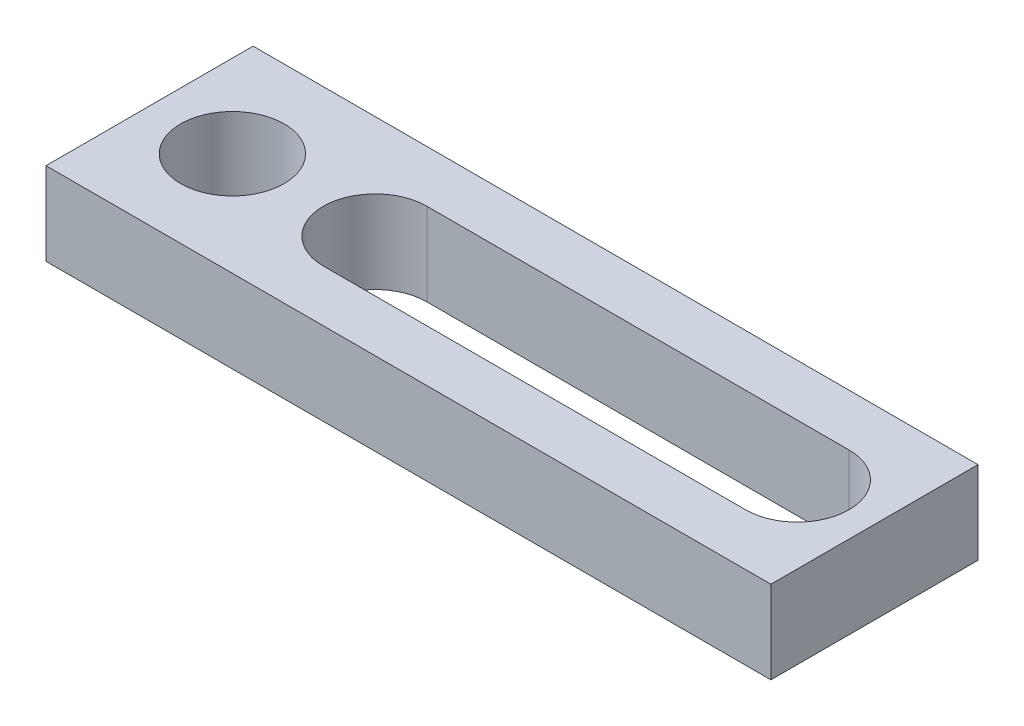
ISO-10303-21;
HEADER;
FILE_DESCRIPTION(('STEP AP214'),'2;1');
FILE_NAME('part.step','',(''),(''),'','','');
FILE_SCHEMA(('AUTOMOTIVE_DESIGN { 1 0 10303 214 1 1 1 1 }'));
ENDSEC;
DATA;
#1=APPLICATION_CONTEXT('core data for automotive mechanical design processes');
#2=APPLICATION_PROTOCOL_DEFINITION('international standard','automotive_design',2000,#1);
#3=PRODUCT_CONTEXT('',#1,'mechanical');
#4=PRODUCT('Part','Part','',(#3));
#5=PRODUCT_RELATED_PRODUCT_CATEGORY('part','',(#4));
#6=PRODUCT_DEFINITION_FORMATION('','',#4);
#7=PRODUCT_DEFINITION_CONTEXT('part definition',#1,'design');
#8=PRODUCT_DEFINITION('design','',#6,#7);
#9=PRODUCT_DEFINITION_SHAPE('','',#8);
#10=(LENGTH_UNIT() NAMED_UNIT(*) SI_UNIT(.MILLI.,.METRE.));
#11=(NAMED_UNIT(*) PLANE_ANGLE_UNIT() SI_UNIT($,.RADIAN.));
#12=(NAMED_UNIT(*) SI_UNIT($,.STERADIAN.) SOLID_ANGLE_UNIT());
#13=UNCERTAINTY_MEASURE_WITH_UNIT(LENGTH_MEASURE(1.E-05),#10,'distance_accuracy_value','');
#14=(GEOMETRIC_REPRESENTATION_CONTEXT(3) GLOBAL_UNCERTAINTY_ASSIGNED_CONTEXT((#13)) GLOBAL_UNIT_ASSIGNED_CONTEXT((#10,
#11,#12)) REPRESENTATION_CONTEXT('',''));
#15=CARTESIAN_POINT('',(0.,0.,0.));
#16=DIRECTION('',(0.,0.,1.));
#17=DIRECTION('',(1.,0.,0.));
#18=AXIS2_PLACEMENT_3D('',#15,#16,#17);
#19=CARTESIAN_POINT('',(0.,8.,0.));
#20=DIRECTION('',(0.,-1.,0.));
#21=DIRECTION('',(0.,0.,-1.));
#22=AXIS2_PLACEMENT_3D('',#19,#20,#21);
#23=PLANE('',#22);
#24=CARTESIAN_POINT('',(-38.,8.,-4.23684583386693));
#25=DIRECTION('',(0.,1.,0.));
#26=DIRECTION('',(0.,0.,1.));
#27=AXIS2_PLACEMENT_3D('',#24,#25,#26);
#28=CIRCLE('',#27,5.);
#29=CARTESIAN_POINT('',(-38.,8.,0.763154166133065));
#30=VERTEX_POINT('',#29);
#31=EDGE_CURVE('E140',#30,#30,#28,.T.);
#32=ORIENTED_EDGE('',*,*,#31,.F.);
#33=EDGE_LOOP('',(#32));
#34=FACE_BOUND('',#33,.T.);
#35=DIRECTION('',(0.,0.,1.));
#36=VECTOR('',#35,1.);
#37=CARTESIAN_POINT('',(-46.,8.,-14.2368458338669));
#38=LINE('',#37,#36);
#39=CARTESIAN_POINT('',(-46.,8.,-14.2368458338669));
#40=VERTEX_POINT('',#39);
#41=CARTESIAN_POINT('',(-46.,8.,5.76315416613307));
#42=VERTEX_POINT('',#41);
#43=EDGE_CURVE('E146',#40,#42,#38,.T.);
#44=ORIENTED_EDGE('',*,*,#43,.T.);
#45=DIRECTION('',(1.,0.,0.));
#46=VECTOR('',#45,1.);
#47=CARTESIAN_POINT('',(24.,8.,5.76315416613306));
#48=LINE('',#47,#46);
#49=CARTESIAN_POINT('',(24.,8.,5.76315416613306));
#50=VERTEX_POINT('',#49);
#51=EDGE_CURVE('E149',#42,#50,#48,.T.);
#52=ORIENTED_EDGE('',*,*,#51,.T.);
#53=DIRECTION('',(0.,0.,-1.));
#54=VECTOR('',#53,1.);
#55=CARTESIAN_POINT('',(24.,8.,-14.2368458338669));
#56=LINE('',#55,#54);
#57=CARTESIAN_POINT('',(24.,8.,-14.2368458338669));
#58=VERTEX_POINT('',#57);
#59=EDGE_CURVE('E152',#50,#58,#56,.T.);
#60=ORIENTED_EDGE('',*,*,#59,.T.);
#61=DIRECTION('',(-1.,0.,0.));
#62=VECTOR('',#61,1.);
#63=CARTESIAN_POINT('',(24.,8.,-14.2368458338669));
#64=LINE('',#63,#62);
#65=EDGE_CURVE('E154',#58,#40,#64,.T.);
#66=ORIENTED_EDGE('',*,*,#65,.T.);
#67=EDGE_LOOP('',(#44,#52,#60,#66));
#68=FACE_BOUND('',#67,.T.);
#69=CARTESIAN_POINT('',(-24.2207569707373,8.,-4.23684583386693));
#70=DIRECTION('',(0.,1.,0.));
#71=DIRECTION('',(0.,0.,1.));
#72=AXIS2_PLACEMENT_3D('',#69,#70,#71);
#73=CIRCLE('',#72,5.);
#74=CARTESIAN_POINT('',(-24.2207569707373,8.,-9.23684583386693));
#75=VERTEX_POINT('',#74);
#76=CARTESIAN_POINT('',(-24.2207569707373,8.,0.763154166133069));
#77=VERTEX_POINT('',#76);
#78=EDGE_CURVE('E104',#75,#77,#73,.T.);
#79=ORIENTED_EDGE('',*,*,#78,.F.);
#80=DIRECTION('',(-1.,0.,0.));
#81=VECTOR('',#80,1.);
#82=CARTESIAN_POINT('',(-24.2207569707373,8.,-9.23684583386693));
#83=LINE('',#82,#81);
#84=CARTESIAN_POINT('',(16.5457953922574,8.,-9.23684583386693));
#85=VERTEX_POINT('',#84);
#86=EDGE_CURVE('E126',#85,#75,#83,.T.);
#87=ORIENTED_EDGE('',*,*,#86,.F.);
#88=CARTESIAN_POINT('',(16.5457953922574,8.,-4.23684583386693));
#89=DIRECTION('',(0.,1.,0.));
#90=DIRECTION('',(0.,0.,1.));
#91=AXIS2_PLACEMENT_3D('',#88,#89,#90);
#92=CIRCLE('',#91,5.);
#93=CARTESIAN_POINT('',(16.5457953922574,8.,0.763154166133068));
#94=VERTEX_POINT('',#93);
#95=EDGE_CURVE('E124',#94,#85,#92,.T.);
#96=ORIENTED_EDGE('',*,*,#95,.F.);
#97=DIRECTION('',(1.,0.,0.));
#98=VECTOR('',#97,1.);
#99=CARTESIAN_POINT('',(-24.2207569707373,8.,0.763154166133069));
#100=LINE('',#99,#98);
#101=EDGE_CURVE('E112',#77,#94,#100,.T.);
#102=ORIENTED_EDGE('',*,*,#101,.F.);
#103=EDGE_LOOP('',(#79,#87,#96,#102));
#104=FACE_BOUND('',#103,.T.);
#105=ADVANCED_FACE('F39',(#34,#68,#104),#23,.F.);
#106=CARTESIAN_POINT('',(0.,0.,0.));
#107=DIRECTION('',(0.,-1.,0.));
#108=DIRECTION('',(0.,0.,-1.));
#109=AXIS2_PLACEMENT_3D('',#106,#107,#108);
#110=PLANE('',#109);
#111=DIRECTION('',(0.,0.,1.));
#112=VECTOR('',#111,1.);
#113=CARTESIAN_POINT('',(-46.,0.,-14.2368458338669));
#114=LINE('',#113,#112);
#115=CARTESIAN_POINT('',(-46.,0.,-14.2368458338669));
#116=VERTEX_POINT('',#115);
#117=CARTESIAN_POINT('',(-46.,0.,5.76315416613307));
#118=VERTEX_POINT('',#117);
#119=EDGE_CURVE('E143',#116,#118,#114,.T.);
#120=ORIENTED_EDGE('',*,*,#119,.F.);
#121=DIRECTION('',(-1.,0.,0.));
#122=VECTOR('',#121,1.);
#123=CARTESIAN_POINT('',(24.,0.,-14.2368458338669));
#124=LINE('',#123,#122);
#125=CARTESIAN_POINT('',(24.,0.,-14.2368458338669));
#126=VERTEX_POINT('',#125);
#127=EDGE_CURVE('E150',#126,#116,#124,.T.);
#128=ORIENTED_EDGE('',*,*,#127,.F.);
#129=DIRECTION('',(0.,0.,-1.));
#130=VECTOR('',#129,1.);
#131=CARTESIAN_POINT('',(24.,0.,-14.2368458338669));
#132=LINE('',#131,#130);
#133=CARTESIAN_POINT('',(24.,0.,5.76315416613306));
#134=VERTEX_POINT('',#133);
#135=EDGE_CURVE('E161',#134,#126,#132,.T.);
#136=ORIENTED_EDGE('',*,*,#135,.F.);
#137=DIRECTION('',(1.,0.,0.));
#138=VECTOR('',#137,1.);
#139=CARTESIAN_POINT('',(24.,0.,5.76315416613306));
#140=LINE('',#139,#138);
#141=EDGE_CURVE('E159',#118,#134,#140,.T.);
#142=ORIENTED_EDGE('',*,*,#141,.F.);
#143=EDGE_LOOP('',(#120,#128,#136,#142));
#144=FACE_BOUND('',#143,.T.);
#145=CARTESIAN_POINT('',(-38.,0.,-4.23684583386693));
#146=DIRECTION('',(0.,1.,0.));
#147=DIRECTION('',(0.,0.,1.));
#148=AXIS2_PLACEMENT_3D('',#145,#146,#147);
#149=CIRCLE('',#148,5.);
#150=CARTESIAN_POINT('',(-38.,0.,0.763154166133065));
#151=VERTEX_POINT('',#150);
#152=EDGE_CURVE('E120',#151,#151,#149,.T.);
#153=ORIENTED_EDGE('',*,*,#152,.T.);
#154=EDGE_LOOP('',(#153));
#155=FACE_BOUND('',#154,.T.);
#156=DIRECTION('',(-1.,0.,0.));
#157=VECTOR('',#156,1.);
#158=CARTESIAN_POINT('',(-24.2207569707373,0.,-9.23684583386693));
#159=LINE('',#158,#157);
#160=CARTESIAN_POINT('',(16.5457953922574,0.,-9.23684583386693));
#161=VERTEX_POINT('',#160);
#162=CARTESIAN_POINT('',(-24.2207569707373,0.,-9.23684583386693));
#163=VERTEX_POINT('',#162);
#164=EDGE_CURVE('E113',#161,#163,#159,.T.);
#165=ORIENTED_EDGE('',*,*,#164,.T.);
#166=CARTESIAN_POINT('',(-24.2207569707373,0.,-4.23684583386693));
#167=DIRECTION('',(0.,1.,0.));
#168=DIRECTION('',(0.,0.,1.));
#169=AXIS2_PLACEMENT_3D('',#166,#167,#168);
#170=CIRCLE('',#169,5.);
#171=CARTESIAN_POINT('',(-24.2207569707373,0.,0.763154166133069));
#172=VERTEX_POINT('',#171);
#173=EDGE_CURVE('E62',#163,#172,#170,.T.);
#174=ORIENTED_EDGE('',*,*,#173,.T.);
#175=DIRECTION('',(1.,0.,0.));
#176=VECTOR('',#175,1.);
#177=CARTESIAN_POINT('',(-24.2207569707373,0.,0.763154166133069));
#178=LINE('',#177,#176);
#179=CARTESIAN_POINT('',(16.5457953922574,0.,0.763154166133068));
#180=VERTEX_POINT('',#179);
#181=EDGE_CURVE('E119',#172,#180,#178,.T.);
#182=ORIENTED_EDGE('',*,*,#181,.T.);
#183=CARTESIAN_POINT('',(16.5457953922574,0.,-4.23684583386693));
#184=DIRECTION('',(0.,1.,0.));
#185=DIRECTION('',(0.,0.,1.));
#186=AXIS2_PLACEMENT_3D('',#183,#184,#185);
#187=CIRCLE('',#186,5.);
#188=EDGE_CURVE('E132',#180,#161,#187,.T.);
#189=ORIENTED_EDGE('',*,*,#188,.T.);
#190=EDGE_LOOP('',(#165,#174,#182,#189));
#191=FACE_BOUND('',#190,.T.);
#192=ADVANCED_FACE('F179',(#144,#155,#191),#110,.T.);
#193=CARTESIAN_POINT('',(-46.,8.,-14.2368458338669));
#194=DIRECTION('',(1.,0.,0.));
#195=DIRECTION('',(0.,0.,-1.));
#196=AXIS2_PLACEMENT_3D('',#193,#194,#195);
#197=PLANE('',#196);
#198=ORIENTED_EDGE('',*,*,#119,.T.);
#199=DIRECTION('',(0.,-1.,0.));
#200=VECTOR('',#199,1.);
#201=CARTESIAN_POINT('',(-46.,8.,5.76315416613307));
#202=LINE('',#201,#200);
#203=EDGE_CURVE('E11',#42,#118,#202,.T.);
#204=ORIENTED_EDGE('',*,*,#203,.F.);
#205=ORIENTED_EDGE('',*,*,#43,.F.);
#206=DIRECTION('',(0.,-1.,0.));
#207=VECTOR('',#206,1.);
#208=CARTESIAN_POINT('',(-46.,8.,-14.2368458338669));
#209=LINE('',#208,#207);
#210=EDGE_CURVE('E156',#40,#116,#209,.T.);
#211=ORIENTED_EDGE('',*,*,#210,.T.);
#212=EDGE_LOOP('',(#198,#204,#205,#211));
#213=FACE_BOUND('',#212,.T.);
#214=ADVANCED_FACE('F41',(#213),#197,.F.);
#215=CARTESIAN_POINT('',(24.,8.,5.76315416613306));
#216=DIRECTION('',(0.,0.,-1.));
#217=DIRECTION('',(-1.,0.,0.));
#218=AXIS2_PLACEMENT_3D('',#215,#216,#217);
#219=PLANE('',#218);
#220=ORIENTED_EDGE('',*,*,#141,.T.);
#221=DIRECTION('',(0.,-1.,0.));
#222=VECTOR('',#221,1.);
#223=CARTESIAN_POINT('',(24.,8.,5.76315416613306));
#224=LINE('',#223,#222);
#225=EDGE_CURVE('E47',#50,#134,#224,.T.);
#226=ORIENTED_EDGE('',*,*,#225,.F.);
#227=ORIENTED_EDGE('',*,*,#51,.F.);
#228=ORIENTED_EDGE('',*,*,#203,.T.);
#229=EDGE_LOOP('',(#220,#226,#227,#228));
#230=FACE_BOUND('',#229,.T.);
#231=ADVANCED_FACE('F189',(#230),#219,.F.);
#232=CARTESIAN_POINT('',(24.,8.,-14.2368458338669));
#233=DIRECTION('',(-1.,0.,0.));
#234=DIRECTION('',(0.,0.,1.));
#235=AXIS2_PLACEMENT_3D('',#232,#233,#234);
#236=PLANE('',#235);
#237=ORIENTED_EDGE('',*,*,#135,.T.);
#238=DIRECTION('',(0.,-1.,0.));
#239=VECTOR('',#238,1.);
#240=CARTESIAN_POINT('',(24.,8.,-14.2368458338669));
#241=LINE('',#240,#239);
#242=EDGE_CURVE('E166',#58,#126,#241,.T.);
#243=ORIENTED_EDGE('',*,*,#242,.F.);
#244=ORIENTED_EDGE('',*,*,#59,.F.);
#245=ORIENTED_EDGE('',*,*,#225,.T.);
#246=EDGE_LOOP('',(#237,#243,#244,#245));
#247=FACE_BOUND('',#246,.T.);
#248=ADVANCED_FACE('F173',(#247),#236,.F.);
#249=CARTESIAN_POINT('',(24.,8.,-14.2368458338669));
#250=DIRECTION('',(0.,0.,1.));
#251=DIRECTION('',(1.,0.,0.));
#252=AXIS2_PLACEMENT_3D('',#249,#250,#251);
#253=PLANE('',#252);
#254=ORIENTED_EDGE('',*,*,#127,.T.);
#255=ORIENTED_EDGE('',*,*,#210,.F.);
#256=ORIENTED_EDGE('',*,*,#65,.F.);
#257=ORIENTED_EDGE('',*,*,#242,.T.);
#258=EDGE_LOOP('',(#254,#255,#256,#257));
#259=FACE_BOUND('',#258,.T.);
#260=ADVANCED_FACE('F183',(#259),#253,.F.);
#261=CARTESIAN_POINT('',(-38.,8.,-4.23684583386693));
#262=DIRECTION('',(0.,-1.,0.));
#263=DIRECTION('',(0.,0.,-1.));
#264=AXIS2_PLACEMENT_3D('',#261,#262,#263);
#265=CYLINDRICAL_SURFACE('',#264,5.);
#266=ORIENTED_EDGE('',*,*,#31,.T.);
#267=EDGE_LOOP('',(#266));
#268=FACE_BOUND('',#267,.T.);
#269=ORIENTED_EDGE('',*,*,#152,.F.);
#270=EDGE_LOOP('',(#269));
#271=FACE_BOUND('',#270,.T.);
#272=ADVANCED_FACE('F205',(#268,#271),#265,.F.);
#273=CARTESIAN_POINT('',(-24.2207569707373,8.,-4.23684583386693));
#274=DIRECTION('',(0.,-1.,0.));
#275=DIRECTION('',(0.,0.,-1.));
#276=AXIS2_PLACEMENT_3D('',#273,#274,#275);
#277=CYLINDRICAL_SURFACE('',#276,5.);
#278=ORIENTED_EDGE('',*,*,#173,.F.);
#279=DIRECTION('',(0.,-1.,0.));
#280=VECTOR('',#279,1.);
#281=CARTESIAN_POINT('',(-24.2207569707373,8.,-9.23684583386693));
#282=LINE('',#281,#280);
#283=EDGE_CURVE('E108',#75,#163,#282,.T.);
#284=ORIENTED_EDGE('',*,*,#283,.F.);
#285=ORIENTED_EDGE('',*,*,#78,.T.);
#286=DIRECTION('',(0.,-1.,0.));
#287=VECTOR('',#286,1.);
#288=CARTESIAN_POINT('',(-24.2207569707373,8.,0.763154166133069));
#289=LINE('',#288,#287);
#290=EDGE_CURVE('E107',#77,#172,#289,.T.);
#291=ORIENTED_EDGE('',*,*,#290,.T.);
#292=EDGE_LOOP('',(#278,#284,#285,#291));
#293=FACE_BOUND('',#292,.T.);
#294=ADVANCED_FACE('F106',(#293),#277,.F.);
#295=CARTESIAN_POINT('',(-24.2207569707373,8.,0.763154166133069));
#296=DIRECTION('',(0.,0.,-1.));
#297=DIRECTION('',(-1.,0.,0.));
#298=AXIS2_PLACEMENT_3D('',#295,#296,#297);
#299=PLANE('',#298);
#300=ORIENTED_EDGE('',*,*,#181,.F.);
#301=ORIENTED_EDGE('',*,*,#290,.F.);
#302=ORIENTED_EDGE('',*,*,#101,.T.);
#303=DIRECTION('',(0.,-1.,0.));
#304=VECTOR('',#303,1.);
#305=CARTESIAN_POINT('',(16.5457953922574,8.,0.763154166133068));
#306=LINE('',#305,#304);
#307=EDGE_CURVE('E121',#94,#180,#306,.T.);
#308=ORIENTED_EDGE('',*,*,#307,.T.);
#309=EDGE_LOOP('',(#300,#301,#302,#308));
#310=FACE_BOUND('',#309,.T.);
#311=ADVANCED_FACE('F116',(#310),#299,.T.);
#312=CARTESIAN_POINT('',(16.5457953922574,8.,-4.23684583386693));
#313=DIRECTION('',(0.,-1.,0.));
#314=DIRECTION('',(0.,0.,-1.));
#315=AXIS2_PLACEMENT_3D('',#312,#313,#314);
#316=CYLINDRICAL_SURFACE('',#315,5.);
#317=ORIENTED_EDGE('',*,*,#188,.F.);
#318=ORIENTED_EDGE('',*,*,#307,.F.);
#319=ORIENTED_EDGE('',*,*,#95,.T.);
#320=DIRECTION('',(0.,-1.,0.));
#321=VECTOR('',#320,1.);
#322=CARTESIAN_POINT('',(16.5457953922574,8.,-9.23684583386693));
#323=LINE('',#322,#321);
#324=EDGE_CURVE('E54',#85,#161,#323,.T.);
#325=ORIENTED_EDGE('',*,*,#324,.T.);
#326=EDGE_LOOP('',(#317,#318,#319,#325));
#327=FACE_BOUND('',#326,.T.);
#328=ADVANCED_FACE('F222',(#327),#316,.F.);
#329=CARTESIAN_POINT('',(-24.2207569707373,8.,-9.23684583386693));
#330=DIRECTION('',(0.,0.,1.));
#331=DIRECTION('',(1.,0.,0.));
#332=AXIS2_PLACEMENT_3D('',#329,#330,#331);
#333=PLANE('',#332);
#334=ORIENTED_EDGE('',*,*,#164,.F.);
#335=ORIENTED_EDGE('',*,*,#324,.F.);
#336=ORIENTED_EDGE('',*,*,#86,.T.);
#337=ORIENTED_EDGE('',*,*,#283,.T.);
#338=EDGE_LOOP('',(#334,#335,#336,#337));
#339=FACE_BOUND('',#338,.T.);
#340=ADVANCED_FACE('F220',(#339),#333,.T.);
#341=CLOSED_SHELL('',(#105,#192,#214,#231,#248,#260,#272,#294,#311,#328,#340));
#342=MANIFOLD_SOLID_BREP('B2',#341);
#343=ADVANCED_BREP_SHAPE_REPRESENTATION('',(#18,#342),#14);
#344=SHAPE_DEFINITION_REPRESENTATION(#9,#343);
ENDSEC;
END-ISO-10303-21;
